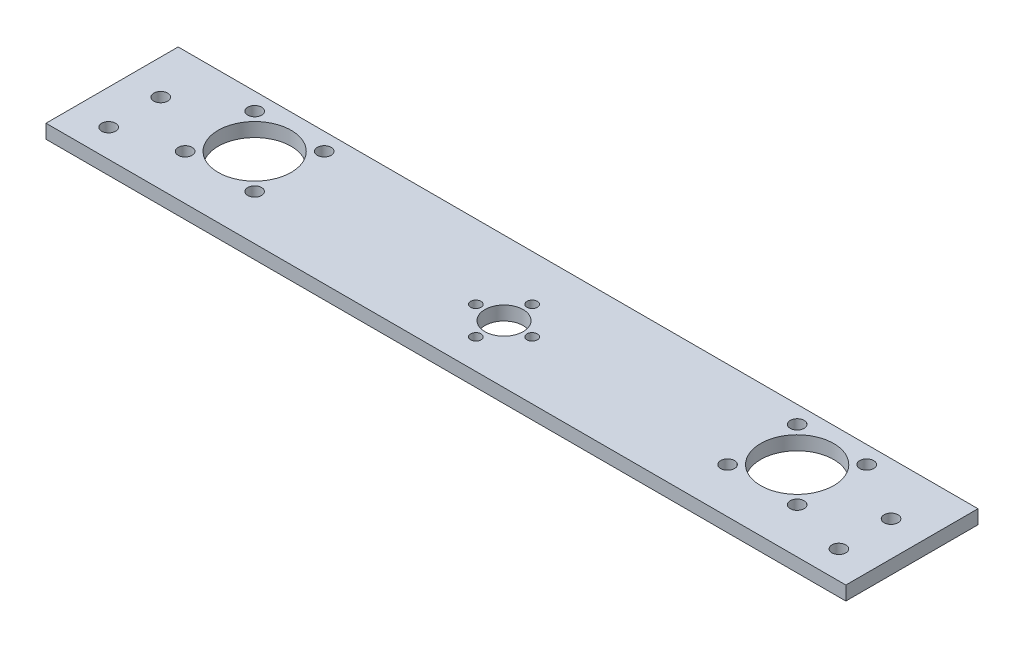
ISO-10303-21;
HEADER;
FILE_DESCRIPTION(('STEP AP214'),'2;1');
FILE_NAME('part.step','',(''),(''),'','','');
FILE_SCHEMA(('AUTOMOTIVE_DESIGN { 1 0 10303 214 1 1 1 1 }'));
ENDSEC;
DATA;
#1=APPLICATION_CONTEXT('core data for automotive mechanical design processes');
#2=APPLICATION_PROTOCOL_DEFINITION('international standard','automotive_design',2000,#1);
#3=PRODUCT_CONTEXT('',#1,'mechanical');
#4=PRODUCT('Part','Part','',(#3));
#5=PRODUCT_RELATED_PRODUCT_CATEGORY('part','',(#4));
#6=PRODUCT_DEFINITION_FORMATION('','',#4);
#7=PRODUCT_DEFINITION_CONTEXT('part definition',#1,'design');
#8=PRODUCT_DEFINITION('design','',#6,#7);
#9=PRODUCT_DEFINITION_SHAPE('','',#8);
#10=(LENGTH_UNIT() NAMED_UNIT(*) SI_UNIT(.MILLI.,.METRE.));
#11=(NAMED_UNIT(*) PLANE_ANGLE_UNIT() SI_UNIT($,.RADIAN.));
#12=(NAMED_UNIT(*) SI_UNIT($,.STERADIAN.) SOLID_ANGLE_UNIT());
#13=UNCERTAINTY_MEASURE_WITH_UNIT(LENGTH_MEASURE(1.E-05),#10,'distance_accuracy_value','');
#14=(GEOMETRIC_REPRESENTATION_CONTEXT(3) GLOBAL_UNCERTAINTY_ASSIGNED_CONTEXT((#13)) GLOBAL_UNIT_ASSIGNED_CONTEXT((#10,
#11,#12)) REPRESENTATION_CONTEXT('',''));
#15=CARTESIAN_POINT('',(0.,0.,0.));
#16=DIRECTION('',(0.,0.,1.));
#17=DIRECTION('',(1.,0.,0.));
#18=AXIS2_PLACEMENT_3D('',#15,#16,#17);
#19=CARTESIAN_POINT('',(-112.5,4.,8.));
#20=DIRECTION('',(0.,0.,-1.));
#21=DIRECTION('',(-1.,0.,0.));
#22=AXIS2_PLACEMENT_3D('',#19,#20,#21);
#23=PLANE('',#22);
#24=DIRECTION('',(1.,0.,0.));
#25=VECTOR('',#24,1.);
#26=CARTESIAN_POINT('',(-112.5,0.,8.));
#27=LINE('',#26,#25);
#28=CARTESIAN_POINT('',(-117.5,0.,8.));
#29=VERTEX_POINT('',#28);
#30=CARTESIAN_POINT('',(112.5,0.,8.));
#31=VERTEX_POINT('',#30);
#32=EDGE_CURVE('E62',#29,#31,#27,.T.);
#33=ORIENTED_EDGE('',*,*,#32,.T.);
#34=DIRECTION('',(0.,-1.,0.));
#35=VECTOR('',#34,1.);
#36=CARTESIAN_POINT('',(112.5,4.,8.));
#37=LINE('',#36,#35);
#38=CARTESIAN_POINT('',(112.5,4.,8.));
#39=VERTEX_POINT('',#38);
#40=EDGE_CURVE('E11',#39,#31,#37,.T.);
#41=ORIENTED_EDGE('',*,*,#40,.F.);
#42=DIRECTION('',(1.,0.,0.));
#43=VECTOR('',#42,1.);
#44=CARTESIAN_POINT('',(-112.5,4.,8.));
#45=LINE('',#44,#43);
#46=CARTESIAN_POINT('',(-117.5,4.,8.));
#47=VERTEX_POINT('',#46);
#48=EDGE_CURVE('E75',#47,#39,#45,.T.);
#49=ORIENTED_EDGE('',*,*,#48,.F.);
#50=DIRECTION('',(0.,1.,0.));
#51=VECTOR('',#50,1.);
#52=CARTESIAN_POINT('',(-117.5,0.,8.));
#53=LINE('',#52,#51);
#54=EDGE_CURVE('E77',#29,#47,#53,.T.);
#55=ORIENTED_EDGE('',*,*,#54,.F.);
#56=EDGE_LOOP('',(#33,#41,#49,#55));
#57=FACE_BOUND('',#56,.T.);
#58=ADVANCED_FACE('F33',(#57),#23,.F.);
#59=CARTESIAN_POINT('',(112.5,4.,-30.));
#60=DIRECTION('',(-1.,0.,0.));
#61=DIRECTION('',(0.,0.,1.));
#62=AXIS2_PLACEMENT_3D('',#59,#60,#61);
#63=PLANE('',#62);
#64=DIRECTION('',(0.,0.,-1.));
#65=VECTOR('',#64,1.);
#66=CARTESIAN_POINT('',(112.5,0.,-30.));
#67=LINE('',#66,#65);
#68=CARTESIAN_POINT('',(112.5,0.,-30.));
#69=VERTEX_POINT('',#68);
#70=EDGE_CURVE('E125',#31,#69,#67,.T.);
#71=ORIENTED_EDGE('',*,*,#70,.T.);
#72=DIRECTION('',(0.,-1.,0.));
#73=VECTOR('',#72,1.);
#74=CARTESIAN_POINT('',(112.5,4.,-30.));
#75=LINE('',#74,#73);
#76=CARTESIAN_POINT('',(112.5,4.,-30.));
#77=VERTEX_POINT('',#76);
#78=EDGE_CURVE('E42',#77,#69,#75,.T.);
#79=ORIENTED_EDGE('',*,*,#78,.F.);
#80=DIRECTION('',(0.,0.,-1.));
#81=VECTOR('',#80,1.);
#82=CARTESIAN_POINT('',(112.5,4.,-30.));
#83=LINE('',#82,#81);
#84=EDGE_CURVE('E51',#39,#77,#83,.T.);
#85=ORIENTED_EDGE('',*,*,#84,.F.);
#86=ORIENTED_EDGE('',*,*,#40,.T.);
#87=EDGE_LOOP('',(#71,#79,#85,#86));
#88=FACE_BOUND('',#87,.T.);
#89=ADVANCED_FACE('F234',(#88),#63,.F.);
#90=CARTESIAN_POINT('',(-112.5,4.,-30.));
#91=DIRECTION('',(0.,0.,1.));
#92=DIRECTION('',(1.,0.,0.));
#93=AXIS2_PLACEMENT_3D('',#90,#91,#92);
#94=PLANE('',#93);
#95=DIRECTION('',(0.,1.,0.));
#96=VECTOR('',#95,1.);
#97=CARTESIAN_POINT('',(-117.5,0.,-30.));
#98=LINE('',#97,#96);
#99=CARTESIAN_POINT('',(-117.5,0.,-30.));
#100=VERTEX_POINT('',#99);
#101=CARTESIAN_POINT('',(-117.5,4.,-30.));
#102=VERTEX_POINT('',#101);
#103=EDGE_CURVE('E89',#100,#102,#98,.T.);
#104=ORIENTED_EDGE('',*,*,#103,.T.);
#105=DIRECTION('',(-1.,0.,0.));
#106=VECTOR('',#105,1.);
#107=CARTESIAN_POINT('',(-112.5,4.,-30.));
#108=LINE('',#107,#106);
#109=EDGE_CURVE('E94',#77,#102,#108,.T.);
#110=ORIENTED_EDGE('',*,*,#109,.F.);
#111=ORIENTED_EDGE('',*,*,#78,.T.);
#112=DIRECTION('',(-1.,0.,0.));
#113=VECTOR('',#112,1.);
#114=CARTESIAN_POINT('',(-112.5,0.,-30.));
#115=LINE('',#114,#113);
#116=EDGE_CURVE('E80',#69,#100,#115,.T.);
#117=ORIENTED_EDGE('',*,*,#116,.T.);
#118=EDGE_LOOP('',(#104,#110,#111,#117));
#119=FACE_BOUND('',#118,.T.);
#120=ADVANCED_FACE('F225',(#119),#94,.F.);
#121=CARTESIAN_POINT('',(0.,4.,0.));
#122=DIRECTION('',(0.,1.,0.));
#123=DIRECTION('',(0.,0.,1.));
#124=AXIS2_PLACEMENT_3D('',#121,#122,#123);
#125=PLANE('',#124);
#126=CARTESIAN_POINT('',(-10.5999999999201,4.,-8.70000000007985));
#127=DIRECTION('',(0.,1.,0.));
#128=DIRECTION('',(1.,0.,0.));
#129=AXIS2_PLACEMENT_3D('',#126,#127,#128);
#130=CIRCLE('',#129,1.5);
#131=CARTESIAN_POINT('',(-9.09999999992013,4.,-8.70000000007985));
#132=VERTEX_POINT('',#131);
#133=EDGE_CURVE('E173',#132,#132,#130,.T.);
#134=ORIENTED_EDGE('',*,*,#133,.F.);
#135=EDGE_LOOP('',(#134));
#136=FACE_BOUND('',#135,.T.);
#137=CARTESIAN_POINT('',(-2.50000000000002,4.,-0.600000000159754));
#138=DIRECTION('',(0.,1.,0.));
#139=DIRECTION('',(0.,0.,-1.));
#140=AXIS2_PLACEMENT_3D('',#137,#138,#139);
#141=CIRCLE('',#140,1.5);
#142=CARTESIAN_POINT('',(-2.50000000000002,4.,-2.10000000015976));
#143=VERTEX_POINT('',#142);
#144=EDGE_CURVE('E493',#143,#143,#141,.T.);
#145=ORIENTED_EDGE('',*,*,#144,.F.);
#146=EDGE_LOOP('',(#145));
#147=FACE_BOUND('',#146,.T.);
#148=CARTESIAN_POINT('',(5.5999999999201,4.,-8.70000000007996));
#149=DIRECTION('',(0.,1.,0.));
#150=DIRECTION('',(-1.,0.,0.));
#151=AXIS2_PLACEMENT_3D('',#148,#149,#150);
#152=CIRCLE('',#151,1.5);
#153=CARTESIAN_POINT('',(4.0999999999201,4.,-8.70000000007995));
#154=VERTEX_POINT('',#153);
#155=EDGE_CURVE('E186',#154,#154,#152,.T.);
#156=ORIENTED_EDGE('',*,*,#155,.F.);
#157=EDGE_LOOP('',(#156));
#158=FACE_BOUND('',#157,.T.);
#159=CARTESIAN_POINT('',(-2.50000000000002,4.,-16.8));
#160=DIRECTION('',(0.,1.,0.));
#161=DIRECTION('',(0.,0.,1.));
#162=AXIS2_PLACEMENT_3D('',#159,#160,#161);
#163=CIRCLE('',#162,1.5);
#164=CARTESIAN_POINT('',(-2.50000000000002,4.,-15.3));
#165=VERTEX_POINT('',#164);
#166=EDGE_CURVE('E169',#165,#165,#163,.T.);
#167=ORIENTED_EDGE('',*,*,#166,.F.);
#168=EDGE_LOOP('',(#167));
#169=FACE_BOUND('',#168,.T.);
#170=CARTESIAN_POINT('',(85.5,4.,-5.00000000000008));
#171=DIRECTION('',(0.,1.,0.));
#172=DIRECTION('',(0.,0.,1.));
#173=AXIS2_PLACEMENT_3D('',#170,#171,#172);
#174=CIRCLE('',#173,2.);
#175=CARTESIAN_POINT('',(85.5,4.,-3.00000000000009));
#176=VERTEX_POINT('',#175);
#177=EDGE_CURVE('E197',#176,#176,#174,.T.);
#178=ORIENTED_EDGE('',*,*,#177,.F.);
#179=EDGE_LOOP('',(#178));
#180=FACE_BOUND('',#179,.T.);
#181=CARTESIAN_POINT('',(85.5,4.,-25.0000000000001));
#182=DIRECTION('',(0.,1.,0.));
#183=DIRECTION('',(0.,0.,1.));
#184=AXIS2_PLACEMENT_3D('',#181,#182,#183);
#185=CIRCLE('',#184,2.);
#186=CARTESIAN_POINT('',(85.5,4.,-23.0000000000001));
#187=VERTEX_POINT('',#186);
#188=EDGE_CURVE('E200',#187,#187,#185,.T.);
#189=ORIENTED_EDGE('',*,*,#188,.F.);
#190=EDGE_LOOP('',(#189));
#191=FACE_BOUND('',#190,.T.);
#192=CARTESIAN_POINT('',(65.5,4.,-25.0000000000001));
#193=DIRECTION('',(0.,1.,0.));
#194=DIRECTION('',(0.,0.,1.));
#195=AXIS2_PLACEMENT_3D('',#192,#193,#194);
#196=CIRCLE('',#195,2.);
#197=CARTESIAN_POINT('',(65.5,4.,-23.0000000000001));
#198=VERTEX_POINT('',#197);
#199=EDGE_CURVE('E203',#198,#198,#196,.T.);
#200=ORIENTED_EDGE('',*,*,#199,.F.);
#201=EDGE_LOOP('',(#200));
#202=FACE_BOUND('',#201,.T.);
#203=CARTESIAN_POINT('',(-70.5,4.,-25.0000000000001));
#204=DIRECTION('',(0.,1.,0.));
#205=DIRECTION('',(0.,0.,-1.));
#206=AXIS2_PLACEMENT_3D('',#203,#204,#205);
#207=CIRCLE('',#206,2.);
#208=CARTESIAN_POINT('',(-70.5,4.,-27.0000000000001));
#209=VERTEX_POINT('',#208);
#210=EDGE_CURVE('E191',#209,#209,#207,.T.);
#211=ORIENTED_EDGE('',*,*,#210,.F.);
#212=EDGE_LOOP('',(#211));
#213=FACE_BOUND('',#212,.T.);
#214=CARTESIAN_POINT('',(-90.5,4.,-25.0000000000001));
#215=DIRECTION('',(0.,1.,0.));
#216=DIRECTION('',(0.,0.,-1.));
#217=AXIS2_PLACEMENT_3D('',#214,#215,#216);
#218=CIRCLE('',#217,2.);
#219=CARTESIAN_POINT('',(-90.5,4.,-27.0000000000001));
#220=VERTEX_POINT('',#219);
#221=EDGE_CURVE('E188',#220,#220,#218,.T.);
#222=ORIENTED_EDGE('',*,*,#221,.F.);
#223=EDGE_LOOP('',(#222));
#224=FACE_BOUND('',#223,.T.);
#225=CARTESIAN_POINT('',(-90.5,4.,-5.00000000000008));
#226=DIRECTION('',(0.,1.,0.));
#227=DIRECTION('',(0.,0.,-1.));
#228=AXIS2_PLACEMENT_3D('',#225,#226,#227);
#229=CIRCLE('',#228,2.);
#230=CARTESIAN_POINT('',(-90.5,4.,-7.00000000000008));
#231=VERTEX_POINT('',#230);
#232=EDGE_CURVE('E192',#231,#231,#229,.T.);
#233=ORIENTED_EDGE('',*,*,#232,.F.);
#234=EDGE_LOOP('',(#233));
#235=FACE_BOUND('',#234,.T.);
#236=CARTESIAN_POINT('',(-70.5,4.,-5.0000000000001));
#237=DIRECTION('',(0.,1.,0.));
#238=DIRECTION('',(0.,0.,-1.));
#239=AXIS2_PLACEMENT_3D('',#236,#237,#238);
#240=CIRCLE('',#239,2.);
#241=CARTESIAN_POINT('',(-70.5,4.,-7.0000000000001));
#242=VERTEX_POINT('',#241);
#243=EDGE_CURVE('E168',#242,#242,#240,.T.);
#244=ORIENTED_EDGE('',*,*,#243,.F.);
#245=EDGE_LOOP('',(#244));
#246=FACE_BOUND('',#245,.T.);
#247=CARTESIAN_POINT('',(65.5,4.,-5.0000000000001));
#248=DIRECTION('',(0.,1.,0.));
#249=DIRECTION('',(0.,0.,1.));
#250=AXIS2_PLACEMENT_3D('',#247,#248,#249);
#251=CIRCLE('',#250,2.);
#252=CARTESIAN_POINT('',(65.5,4.,-3.00000000000011));
#253=VERTEX_POINT('',#252);
#254=EDGE_CURVE('E143',#253,#253,#251,.T.);
#255=ORIENTED_EDGE('',*,*,#254,.F.);
#256=EDGE_LOOP('',(#255));
#257=FACE_BOUND('',#256,.T.);
#258=CARTESIAN_POINT('',(-107.5,4.,0.));
#259=DIRECTION('',(0.,1.,0.));
#260=DIRECTION('',(0.,0.,-1.));
#261=AXIS2_PLACEMENT_3D('',#258,#259,#260);
#262=CIRCLE('',#261,2.);
#263=CARTESIAN_POINT('',(-107.5,4.,-2.00000000000002));
#264=VERTEX_POINT('',#263);
#265=EDGE_CURVE('E164',#264,#264,#262,.T.);
#266=ORIENTED_EDGE('',*,*,#265,.F.);
#267=EDGE_LOOP('',(#266));
#268=FACE_BOUND('',#267,.T.);
#269=CARTESIAN_POINT('',(-107.5,4.,-15.));
#270=DIRECTION('',(0.,1.,0.));
#271=DIRECTION('',(0.,0.,-1.));
#272=AXIS2_PLACEMENT_3D('',#269,#270,#271);
#273=CIRCLE('',#272,2.);
#274=CARTESIAN_POINT('',(-107.5,4.,-17.));
#275=VERTEX_POINT('',#274);
#276=EDGE_CURVE('E213',#275,#275,#273,.T.);
#277=ORIENTED_EDGE('',*,*,#276,.F.);
#278=EDGE_LOOP('',(#277));
#279=FACE_BOUND('',#278,.T.);
#280=CARTESIAN_POINT('',(102.5,4.,-15.));
#281=DIRECTION('',(0.,1.,0.));
#282=DIRECTION('',(0.,0.,1.));
#283=AXIS2_PLACEMENT_3D('',#280,#281,#282);
#284=CIRCLE('',#283,2.);
#285=CARTESIAN_POINT('',(102.5,4.,-13.));
#286=VERTEX_POINT('',#285);
#287=EDGE_CURVE('E210',#286,#286,#284,.T.);
#288=ORIENTED_EDGE('',*,*,#287,.F.);
#289=EDGE_LOOP('',(#288));
#290=FACE_BOUND('',#289,.T.);
#291=CARTESIAN_POINT('',(102.5,4.,0.));
#292=DIRECTION('',(0.,1.,0.));
#293=DIRECTION('',(0.,0.,1.));
#294=AXIS2_PLACEMENT_3D('',#291,#292,#293);
#295=CIRCLE('',#294,2.);
#296=CARTESIAN_POINT('',(102.5,4.,1.99999999999997));
#297=VERTEX_POINT('',#296);
#298=EDGE_CURVE('E134',#297,#297,#295,.T.);
#299=ORIENTED_EDGE('',*,*,#298,.F.);
#300=EDGE_LOOP('',(#299));
#301=FACE_BOUND('',#300,.T.);
#302=ORIENTED_EDGE('',*,*,#48,.T.);
#303=ORIENTED_EDGE('',*,*,#84,.T.);
#304=ORIENTED_EDGE('',*,*,#109,.T.);
#305=DIRECTION('',(0.,0.,1.));
#306=VECTOR('',#305,1.);
#307=CARTESIAN_POINT('',(-117.5,4.,-30.));
#308=LINE('',#307,#306);
#309=EDGE_CURVE('E86',#102,#47,#308,.T.);
#310=ORIENTED_EDGE('',*,*,#309,.T.);
#311=EDGE_LOOP('',(#302,#303,#304,#310));
#312=FACE_BOUND('',#311,.T.);
#313=CARTESIAN_POINT('',(75.5,4.,-15.));
#314=DIRECTION('',(0.,1.,0.));
#315=DIRECTION('',(0.,0.,1.));
#316=AXIS2_PLACEMENT_3D('',#313,#314,#315);
#317=CIRCLE('',#316,10.5);
#318=CARTESIAN_POINT('',(75.5,4.,-4.50000000000004));
#319=VERTEX_POINT('',#318);
#320=EDGE_CURVE('E105',#319,#319,#317,.T.);
#321=ORIENTED_EDGE('',*,*,#320,.F.);
#322=EDGE_LOOP('',(#321));
#323=FACE_BOUND('',#322,.T.);
#324=CARTESIAN_POINT('',(-80.5,4.,-15.));
#325=DIRECTION('',(0.,1.,0.));
#326=DIRECTION('',(0.,0.,1.));
#327=AXIS2_PLACEMENT_3D('',#324,#325,#326);
#328=CIRCLE('',#327,10.5);
#329=CARTESIAN_POINT('',(-80.5,4.,-4.50000000000004));
#330=VERTEX_POINT('',#329);
#331=EDGE_CURVE('E112',#330,#330,#328,.T.);
#332=ORIENTED_EDGE('',*,*,#331,.F.);
#333=EDGE_LOOP('',(#332));
#334=FACE_BOUND('',#333,.T.);
#335=CARTESIAN_POINT('',(-2.50000000000002,4.,-8.70000000007988));
#336=DIRECTION('',(0.,1.,0.));
#337=DIRECTION('',(0.,0.,1.));
#338=AXIS2_PLACEMENT_3D('',#335,#336,#337);
#339=CIRCLE('',#338,5.5);
#340=CARTESIAN_POINT('',(-2.50000000000002,4.,-3.20000000007988));
#341=VERTEX_POINT('',#340);
#342=EDGE_CURVE('E88',#341,#341,#339,.T.);
#343=ORIENTED_EDGE('',*,*,#342,.F.);
#344=EDGE_LOOP('',(#343));
#345=FACE_BOUND('',#344,.T.);
#346=ADVANCED_FACE('F91',(#136,#147,#158,#169,#180,#191,#202,#213,#224,#235,#246,#257,#268,#279,
#290,#301,#312,#323,#334,#345),#125,.T.);
#347=CARTESIAN_POINT('',(0.,0.,0.));
#348=DIRECTION('',(0.,1.,0.));
#349=DIRECTION('',(0.,0.,1.));
#350=AXIS2_PLACEMENT_3D('',#347,#348,#349);
#351=PLANE('',#350);
#352=CARTESIAN_POINT('',(-10.5999999999201,0.,-8.70000000007985));
#353=DIRECTION('',(0.,1.,0.));
#354=DIRECTION('',(0.,0.,1.));
#355=AXIS2_PLACEMENT_3D('',#352,#353,#354);
#356=CIRCLE('',#355,1.5);
#357=CARTESIAN_POINT('',(-10.5999999999201,0.,-7.20000000007985));
#358=VERTEX_POINT('',#357);
#359=EDGE_CURVE('E36',#358,#358,#356,.T.);
#360=ORIENTED_EDGE('',*,*,#359,.T.);
#361=EDGE_LOOP('',(#360));
#362=FACE_BOUND('',#361,.T.);
#363=CARTESIAN_POINT('',(-2.50000000000002,0.,-0.600000000159754));
#364=DIRECTION('',(0.,1.,0.));
#365=DIRECTION('',(0.,0.,1.));
#366=AXIS2_PLACEMENT_3D('',#363,#364,#365);
#367=CIRCLE('',#366,1.5);
#368=CARTESIAN_POINT('',(-2.50000000000002,0.,0.899999999840248));
#369=VERTEX_POINT('',#368);
#370=EDGE_CURVE('E172',#369,#369,#367,.T.);
#371=ORIENTED_EDGE('',*,*,#370,.T.);
#372=EDGE_LOOP('',(#371));
#373=FACE_BOUND('',#372,.T.);
#374=CARTESIAN_POINT('',(5.5999999999201,0.,-8.70000000007996));
#375=DIRECTION('',(0.,1.,0.));
#376=DIRECTION('',(0.,0.,1.));
#377=AXIS2_PLACEMENT_3D('',#374,#375,#376);
#378=CIRCLE('',#377,1.5);
#379=CARTESIAN_POINT('',(5.5999999999201,0.,-7.20000000007996));
#380=VERTEX_POINT('',#379);
#381=EDGE_CURVE('E170',#380,#380,#378,.T.);
#382=ORIENTED_EDGE('',*,*,#381,.T.);
#383=EDGE_LOOP('',(#382));
#384=FACE_BOUND('',#383,.T.);
#385=CARTESIAN_POINT('',(-2.50000000000002,0.,-16.8));
#386=DIRECTION('',(0.,1.,0.));
#387=DIRECTION('',(0.,0.,1.));
#388=AXIS2_PLACEMENT_3D('',#385,#386,#387);
#389=CIRCLE('',#388,1.5);
#390=CARTESIAN_POINT('',(-2.50000000000002,0.,-15.3));
#391=VERTEX_POINT('',#390);
#392=EDGE_CURVE('E165',#391,#391,#389,.T.);
#393=ORIENTED_EDGE('',*,*,#392,.T.);
#394=EDGE_LOOP('',(#393));
#395=FACE_BOUND('',#394,.T.);
#396=CARTESIAN_POINT('',(85.5,0.,-5.00000000000008));
#397=DIRECTION('',(0.,1.,0.));
#398=DIRECTION('',(0.,0.,1.));
#399=AXIS2_PLACEMENT_3D('',#396,#397,#398);
#400=CIRCLE('',#399,2.);
#401=CARTESIAN_POINT('',(85.5,0.,-3.00000000000009));
#402=VERTEX_POINT('',#401);
#403=EDGE_CURVE('E161',#402,#402,#400,.T.);
#404=ORIENTED_EDGE('',*,*,#403,.T.);
#405=EDGE_LOOP('',(#404));
#406=FACE_BOUND('',#405,.T.);
#407=CARTESIAN_POINT('',(85.5,0.,-25.0000000000001));
#408=DIRECTION('',(0.,1.,0.));
#409=DIRECTION('',(0.,0.,1.));
#410=AXIS2_PLACEMENT_3D('',#407,#408,#409);
#411=CIRCLE('',#410,2.);
#412=CARTESIAN_POINT('',(85.5,0.,-23.0000000000001));
#413=VERTEX_POINT('',#412);
#414=EDGE_CURVE('E158',#413,#413,#411,.T.);
#415=ORIENTED_EDGE('',*,*,#414,.T.);
#416=EDGE_LOOP('',(#415));
#417=FACE_BOUND('',#416,.T.);
#418=CARTESIAN_POINT('',(65.5,0.,-25.0000000000001));
#419=DIRECTION('',(0.,1.,0.));
#420=DIRECTION('',(0.,0.,1.));
#421=AXIS2_PLACEMENT_3D('',#418,#419,#420);
#422=CIRCLE('',#421,2.);
#423=CARTESIAN_POINT('',(65.5,0.,-23.0000000000001));
#424=VERTEX_POINT('',#423);
#425=EDGE_CURVE('E155',#424,#424,#422,.T.);
#426=ORIENTED_EDGE('',*,*,#425,.T.);
#427=EDGE_LOOP('',(#426));
#428=FACE_BOUND('',#427,.T.);
#429=CARTESIAN_POINT('',(-70.5,0.,-25.0000000000001));
#430=DIRECTION('',(0.,1.,0.));
#431=DIRECTION('',(0.,0.,1.));
#432=AXIS2_PLACEMENT_3D('',#429,#430,#431);
#433=CIRCLE('',#432,2.);
#434=CARTESIAN_POINT('',(-70.5,0.,-23.0000000000001));
#435=VERTEX_POINT('',#434);
#436=EDGE_CURVE('E152',#435,#435,#433,.T.);
#437=ORIENTED_EDGE('',*,*,#436,.T.);
#438=EDGE_LOOP('',(#437));
#439=FACE_BOUND('',#438,.T.);
#440=CARTESIAN_POINT('',(-90.5,0.,-25.0000000000001));
#441=DIRECTION('',(0.,1.,0.));
#442=DIRECTION('',(0.,0.,1.));
#443=AXIS2_PLACEMENT_3D('',#440,#441,#442);
#444=CIRCLE('',#443,2.);
#445=CARTESIAN_POINT('',(-90.5,0.,-23.0000000000001));
#446=VERTEX_POINT('',#445);
#447=EDGE_CURVE('E149',#446,#446,#444,.T.);
#448=ORIENTED_EDGE('',*,*,#447,.T.);
#449=EDGE_LOOP('',(#448));
#450=FACE_BOUND('',#449,.T.);
#451=CARTESIAN_POINT('',(-90.5,0.,-5.00000000000008));
#452=DIRECTION('',(0.,1.,0.));
#453=DIRECTION('',(0.,0.,1.));
#454=AXIS2_PLACEMENT_3D('',#451,#452,#453);
#455=CIRCLE('',#454,2.);
#456=CARTESIAN_POINT('',(-90.5,0.,-3.00000000000009));
#457=VERTEX_POINT('',#456);
#458=EDGE_CURVE('E146',#457,#457,#455,.T.);
#459=ORIENTED_EDGE('',*,*,#458,.T.);
#460=EDGE_LOOP('',(#459));
#461=FACE_BOUND('',#460,.T.);
#462=CARTESIAN_POINT('',(-70.5,0.,-5.0000000000001));
#463=DIRECTION('',(0.,1.,0.));
#464=DIRECTION('',(0.,0.,1.));
#465=AXIS2_PLACEMENT_3D('',#462,#463,#464);
#466=CIRCLE('',#465,2.);
#467=CARTESIAN_POINT('',(-70.5,0.,-3.00000000000011));
#468=VERTEX_POINT('',#467);
#469=EDGE_CURVE('E142',#468,#468,#466,.T.);
#470=ORIENTED_EDGE('',*,*,#469,.T.);
#471=EDGE_LOOP('',(#470));
#472=FACE_BOUND('',#471,.T.);
#473=CARTESIAN_POINT('',(65.5,0.,-5.0000000000001));
#474=DIRECTION('',(0.,1.,0.));
#475=DIRECTION('',(0.,0.,1.));
#476=AXIS2_PLACEMENT_3D('',#473,#474,#475);
#477=CIRCLE('',#476,2.);
#478=CARTESIAN_POINT('',(65.5,0.,-3.00000000000011));
#479=VERTEX_POINT('',#478);
#480=EDGE_CURVE('E139',#479,#479,#477,.T.);
#481=ORIENTED_EDGE('',*,*,#480,.T.);
#482=EDGE_LOOP('',(#481));
#483=FACE_BOUND('',#482,.T.);
#484=CARTESIAN_POINT('',(-107.5,0.,0.));
#485=DIRECTION('',(0.,1.,0.));
#486=DIRECTION('',(0.,0.,1.));
#487=AXIS2_PLACEMENT_3D('',#484,#485,#486);
#488=CIRCLE('',#487,2.);
#489=CARTESIAN_POINT('',(-107.5,0.,1.99999999999997));
#490=VERTEX_POINT('',#489);
#491=EDGE_CURVE('E96',#490,#490,#488,.T.);
#492=ORIENTED_EDGE('',*,*,#491,.T.);
#493=EDGE_LOOP('',(#492));
#494=FACE_BOUND('',#493,.T.);
#495=CARTESIAN_POINT('',(-107.5,0.,-15.));
#496=DIRECTION('',(0.,1.,0.));
#497=DIRECTION('',(0.,0.,1.));
#498=AXIS2_PLACEMENT_3D('',#495,#496,#497);
#499=CIRCLE('',#498,2.);
#500=CARTESIAN_POINT('',(-107.5,0.,-13.));
#501=VERTEX_POINT('',#500);
#502=EDGE_CURVE('E100',#501,#501,#499,.T.);
#503=ORIENTED_EDGE('',*,*,#502,.T.);
#504=EDGE_LOOP('',(#503));
#505=FACE_BOUND('',#504,.T.);
#506=CARTESIAN_POINT('',(102.5,0.,-15.));
#507=DIRECTION('',(0.,1.,0.));
#508=DIRECTION('',(0.,0.,1.));
#509=AXIS2_PLACEMENT_3D('',#506,#507,#508);
#510=CIRCLE('',#509,2.);
#511=CARTESIAN_POINT('',(102.5,0.,-13.));
#512=VERTEX_POINT('',#511);
#513=EDGE_CURVE('E133',#512,#512,#510,.T.);
#514=ORIENTED_EDGE('',*,*,#513,.T.);
#515=EDGE_LOOP('',(#514));
#516=FACE_BOUND('',#515,.T.);
#517=CARTESIAN_POINT('',(102.5,0.,0.));
#518=DIRECTION('',(0.,1.,0.));
#519=DIRECTION('',(0.,0.,1.));
#520=AXIS2_PLACEMENT_3D('',#517,#518,#519);
#521=CIRCLE('',#520,2.);
#522=CARTESIAN_POINT('',(102.5,0.,1.99999999999997));
#523=VERTEX_POINT('',#522);
#524=EDGE_CURVE('E130',#523,#523,#521,.T.);
#525=ORIENTED_EDGE('',*,*,#524,.T.);
#526=EDGE_LOOP('',(#525));
#527=FACE_BOUND('',#526,.T.);
#528=CARTESIAN_POINT('',(75.5,0.,-15.));
#529=DIRECTION('',(0.,1.,0.));
#530=DIRECTION('',(0.,0.,1.));
#531=AXIS2_PLACEMENT_3D('',#528,#529,#530);
#532=CIRCLE('',#531,10.5);
#533=CARTESIAN_POINT('',(75.5,0.,-4.50000000000004));
#534=VERTEX_POINT('',#533);
#535=EDGE_CURVE('E108',#534,#534,#532,.F.);
#536=ORIENTED_EDGE('',*,*,#535,.F.);
#537=EDGE_LOOP('',(#536));
#538=FACE_BOUND('',#537,.T.);
#539=CARTESIAN_POINT('',(-80.5,0.,-15.));
#540=DIRECTION('',(0.,1.,0.));
#541=DIRECTION('',(0.,0.,1.));
#542=AXIS2_PLACEMENT_3D('',#539,#540,#541);
#543=CIRCLE('',#542,10.5);
#544=CARTESIAN_POINT('',(-80.5,0.,-4.50000000000004));
#545=VERTEX_POINT('',#544);
#546=EDGE_CURVE('E109',#545,#545,#543,.F.);
#547=ORIENTED_EDGE('',*,*,#546,.F.);
#548=EDGE_LOOP('',(#547));
#549=FACE_BOUND('',#548,.T.);
#550=CARTESIAN_POINT('',(-2.50000000000002,0.,-8.70000000007988));
#551=DIRECTION('',(0.,1.,0.));
#552=DIRECTION('',(0.,0.,1.));
#553=AXIS2_PLACEMENT_3D('',#550,#551,#552);
#554=CIRCLE('',#553,5.5);
#555=CARTESIAN_POINT('',(-2.50000000000002,0.,-3.20000000007988));
#556=VERTEX_POINT('',#555);
#557=EDGE_CURVE('E115',#556,#556,#554,.F.);
#558=ORIENTED_EDGE('',*,*,#557,.F.);
#559=EDGE_LOOP('',(#558));
#560=FACE_BOUND('',#559,.T.);
#561=DIRECTION('',(0.,0.,1.));
#562=VECTOR('',#561,1.);
#563=CARTESIAN_POINT('',(-117.5,0.,-30.));
#564=LINE('',#563,#562);
#565=EDGE_CURVE('E87',#100,#29,#564,.T.);
#566=ORIENTED_EDGE('',*,*,#565,.F.);
#567=ORIENTED_EDGE('',*,*,#116,.F.);
#568=ORIENTED_EDGE('',*,*,#70,.F.);
#569=ORIENTED_EDGE('',*,*,#32,.F.);
#570=EDGE_LOOP('',(#566,#567,#568,#569));
#571=FACE_BOUND('',#570,.T.);
#572=ADVANCED_FACE('F224',(#362,#373,#384,#395,#406,#417,#428,#439,#450,#461,#472,#483,#494,
#505,#516,#527,#538,#549,#560,#571),#351,.F.);
#573=CARTESIAN_POINT('',(-2.50000000000002,-0.00100000000000013,-8.70000000007988));
#574=DIRECTION('',(0.,1.,0.));
#575=DIRECTION('',(0.,0.,1.));
#576=AXIS2_PLACEMENT_3D('',#573,#574,#575);
#577=CYLINDRICAL_SURFACE('',#576,5.5);
#578=ORIENTED_EDGE('',*,*,#342,.T.);
#579=EDGE_LOOP('',(#578));
#580=FACE_BOUND('',#579,.T.);
#581=ORIENTED_EDGE('',*,*,#557,.T.);
#582=EDGE_LOOP('',(#581));
#583=FACE_BOUND('',#582,.T.);
#584=ADVANCED_FACE('F232',(#580,#583),#577,.F.);
#585=CARTESIAN_POINT('',(-80.5,-0.00100000000000013,-15.));
#586=DIRECTION('',(0.,1.,0.));
#587=DIRECTION('',(0.,0.,1.));
#588=AXIS2_PLACEMENT_3D('',#585,#586,#587);
#589=CYLINDRICAL_SURFACE('',#588,10.5);
#590=ORIENTED_EDGE('',*,*,#331,.T.);
#591=EDGE_LOOP('',(#590));
#592=FACE_BOUND('',#591,.T.);
#593=ORIENTED_EDGE('',*,*,#546,.T.);
#594=EDGE_LOOP('',(#593));
#595=FACE_BOUND('',#594,.T.);
#596=ADVANCED_FACE('F445',(#592,#595),#589,.F.);
#597=CARTESIAN_POINT('',(75.5,-0.00100000000000013,-15.));
#598=DIRECTION('',(0.,1.,0.));
#599=DIRECTION('',(0.,0.,1.));
#600=AXIS2_PLACEMENT_3D('',#597,#598,#599);
#601=CYLINDRICAL_SURFACE('',#600,10.5);
#602=ORIENTED_EDGE('',*,*,#320,.T.);
#603=EDGE_LOOP('',(#602));
#604=FACE_BOUND('',#603,.T.);
#605=ORIENTED_EDGE('',*,*,#535,.T.);
#606=EDGE_LOOP('',(#605));
#607=FACE_BOUND('',#606,.T.);
#608=ADVANCED_FACE('F267',(#604,#607),#601,.F.);
#609=CARTESIAN_POINT('',(-117.5,0.,-30.));
#610=DIRECTION('',(-1.,0.,0.));
#611=DIRECTION('',(0.,0.,1.));
#612=AXIS2_PLACEMENT_3D('',#609,#610,#611);
#613=PLANE('',#612);
#614=ORIENTED_EDGE('',*,*,#309,.F.);
#615=ORIENTED_EDGE('',*,*,#103,.F.);
#616=ORIENTED_EDGE('',*,*,#565,.T.);
#617=ORIENTED_EDGE('',*,*,#54,.T.);
#618=EDGE_LOOP('',(#614,#615,#616,#617));
#619=FACE_BOUND('',#618,.T.);
#620=ADVANCED_FACE('F84',(#619),#613,.T.);
#621=CARTESIAN_POINT('',(102.5,-23.,0.));
#622=DIRECTION('',(0.,1.,0.));
#623=DIRECTION('',(0.,0.,1.));
#624=AXIS2_PLACEMENT_3D('',#621,#622,#623);
#625=CYLINDRICAL_SURFACE('',#624,2.);
#626=ORIENTED_EDGE('',*,*,#298,.T.);
#627=EDGE_LOOP('',(#626));
#628=FACE_BOUND('',#627,.T.);
#629=ORIENTED_EDGE('',*,*,#524,.F.);
#630=EDGE_LOOP('',(#629));
#631=FACE_BOUND('',#630,.T.);
#632=ADVANCED_FACE('F220',(#628,#631),#625,.F.);
#633=CARTESIAN_POINT('',(102.5,-23.,-15.));
#634=DIRECTION('',(0.,1.,0.));
#635=DIRECTION('',(0.,0.,1.));
#636=AXIS2_PLACEMENT_3D('',#633,#634,#635);
#637=CYLINDRICAL_SURFACE('',#636,2.);
#638=ORIENTED_EDGE('',*,*,#287,.T.);
#639=EDGE_LOOP('',(#638));
#640=FACE_BOUND('',#639,.T.);
#641=ORIENTED_EDGE('',*,*,#513,.F.);
#642=EDGE_LOOP('',(#641));
#643=FACE_BOUND('',#642,.T.);
#644=ADVANCED_FACE('F278',(#640,#643),#637,.F.);
#645=CARTESIAN_POINT('',(-107.5,-23.,-15.));
#646=DIRECTION('',(0.,1.,0.));
#647=DIRECTION('',(0.,0.,1.));
#648=AXIS2_PLACEMENT_3D('',#645,#646,#647);
#649=CYLINDRICAL_SURFACE('',#648,2.);
#650=ORIENTED_EDGE('',*,*,#276,.T.);
#651=EDGE_LOOP('',(#650));
#652=FACE_BOUND('',#651,.T.);
#653=ORIENTED_EDGE('',*,*,#502,.F.);
#654=EDGE_LOOP('',(#653));
#655=FACE_BOUND('',#654,.T.);
#656=ADVANCED_FACE('F287',(#652,#655),#649,.F.);
#657=CARTESIAN_POINT('',(-107.5,-23.,0.));
#658=DIRECTION('',(0.,1.,0.));
#659=DIRECTION('',(0.,0.,1.));
#660=AXIS2_PLACEMENT_3D('',#657,#658,#659);
#661=CYLINDRICAL_SURFACE('',#660,2.);
#662=ORIENTED_EDGE('',*,*,#265,.T.);
#663=EDGE_LOOP('',(#662));
#664=FACE_BOUND('',#663,.T.);
#665=ORIENTED_EDGE('',*,*,#491,.F.);
#666=EDGE_LOOP('',(#665));
#667=FACE_BOUND('',#666,.T.);
#668=ADVANCED_FACE('F297',(#664,#667),#661,.F.);
#669=CARTESIAN_POINT('',(65.5,-23.,-5.0000000000001));
#670=DIRECTION('',(0.,1.,0.));
#671=DIRECTION('',(0.,0.,1.));
#672=AXIS2_PLACEMENT_3D('',#669,#670,#671);
#673=CYLINDRICAL_SURFACE('',#672,2.);
#674=ORIENTED_EDGE('',*,*,#254,.T.);
#675=EDGE_LOOP('',(#674));
#676=FACE_BOUND('',#675,.T.);
#677=ORIENTED_EDGE('',*,*,#480,.F.);
#678=EDGE_LOOP('',(#677));
#679=FACE_BOUND('',#678,.T.);
#680=ADVANCED_FACE('F307',(#676,#679),#673,.F.);
#681=CARTESIAN_POINT('',(-70.5,-23.,-5.0000000000001));
#682=DIRECTION('',(0.,1.,0.));
#683=DIRECTION('',(0.,0.,1.));
#684=AXIS2_PLACEMENT_3D('',#681,#682,#683);
#685=CYLINDRICAL_SURFACE('',#684,2.);
#686=ORIENTED_EDGE('',*,*,#243,.T.);
#687=EDGE_LOOP('',(#686));
#688=FACE_BOUND('',#687,.T.);
#689=ORIENTED_EDGE('',*,*,#469,.F.);
#690=EDGE_LOOP('',(#689));
#691=FACE_BOUND('',#690,.T.);
#692=ADVANCED_FACE('F317',(#688,#691),#685,.F.);
#693=CARTESIAN_POINT('',(-90.5,-23.,-5.00000000000008));
#694=DIRECTION('',(0.,1.,0.));
#695=DIRECTION('',(0.,0.,1.));
#696=AXIS2_PLACEMENT_3D('',#693,#694,#695);
#697=CYLINDRICAL_SURFACE('',#696,2.);
#698=ORIENTED_EDGE('',*,*,#232,.T.);
#699=EDGE_LOOP('',(#698));
#700=FACE_BOUND('',#699,.T.);
#701=ORIENTED_EDGE('',*,*,#458,.F.);
#702=EDGE_LOOP('',(#701));
#703=FACE_BOUND('',#702,.T.);
#704=ADVANCED_FACE('F327',(#700,#703),#697,.F.);
#705=CARTESIAN_POINT('',(-90.5,-23.,-25.0000000000001));
#706=DIRECTION('',(0.,1.,0.));
#707=DIRECTION('',(0.,0.,1.));
#708=AXIS2_PLACEMENT_3D('',#705,#706,#707);
#709=CYLINDRICAL_SURFACE('',#708,2.);
#710=ORIENTED_EDGE('',*,*,#221,.T.);
#711=EDGE_LOOP('',(#710));
#712=FACE_BOUND('',#711,.T.);
#713=ORIENTED_EDGE('',*,*,#447,.F.);
#714=EDGE_LOOP('',(#713));
#715=FACE_BOUND('',#714,.T.);
#716=ADVANCED_FACE('F337',(#712,#715),#709,.F.);
#717=CARTESIAN_POINT('',(-70.5,-23.,-25.0000000000001));
#718=DIRECTION('',(0.,1.,0.));
#719=DIRECTION('',(0.,0.,1.));
#720=AXIS2_PLACEMENT_3D('',#717,#718,#719);
#721=CYLINDRICAL_SURFACE('',#720,2.);
#722=ORIENTED_EDGE('',*,*,#210,.T.);
#723=EDGE_LOOP('',(#722));
#724=FACE_BOUND('',#723,.T.);
#725=ORIENTED_EDGE('',*,*,#436,.F.);
#726=EDGE_LOOP('',(#725));
#727=FACE_BOUND('',#726,.T.);
#728=ADVANCED_FACE('F347',(#724,#727),#721,.F.);
#729=CARTESIAN_POINT('',(65.5,-23.,-25.0000000000001));
#730=DIRECTION('',(0.,1.,0.));
#731=DIRECTION('',(0.,0.,1.));
#732=AXIS2_PLACEMENT_3D('',#729,#730,#731);
#733=CYLINDRICAL_SURFACE('',#732,2.);
#734=ORIENTED_EDGE('',*,*,#199,.T.);
#735=EDGE_LOOP('',(#734));
#736=FACE_BOUND('',#735,.T.);
#737=ORIENTED_EDGE('',*,*,#425,.F.);
#738=EDGE_LOOP('',(#737));
#739=FACE_BOUND('',#738,.T.);
#740=ADVANCED_FACE('F357',(#736,#739),#733,.F.);
#741=CARTESIAN_POINT('',(85.5,-23.,-25.0000000000001));
#742=DIRECTION('',(0.,1.,0.));
#743=DIRECTION('',(0.,0.,1.));
#744=AXIS2_PLACEMENT_3D('',#741,#742,#743);
#745=CYLINDRICAL_SURFACE('',#744,2.);
#746=ORIENTED_EDGE('',*,*,#188,.T.);
#747=EDGE_LOOP('',(#746));
#748=FACE_BOUND('',#747,.T.);
#749=ORIENTED_EDGE('',*,*,#414,.F.);
#750=EDGE_LOOP('',(#749));
#751=FACE_BOUND('',#750,.T.);
#752=ADVANCED_FACE('F367',(#748,#751),#745,.F.);
#753=CARTESIAN_POINT('',(85.5,-23.,-5.00000000000008));
#754=DIRECTION('',(0.,1.,0.));
#755=DIRECTION('',(0.,0.,1.));
#756=AXIS2_PLACEMENT_3D('',#753,#754,#755);
#757=CYLINDRICAL_SURFACE('',#756,2.);
#758=ORIENTED_EDGE('',*,*,#177,.T.);
#759=EDGE_LOOP('',(#758));
#760=FACE_BOUND('',#759,.T.);
#761=ORIENTED_EDGE('',*,*,#403,.F.);
#762=EDGE_LOOP('',(#761));
#763=FACE_BOUND('',#762,.T.);
#764=ADVANCED_FACE('F377',(#760,#763),#757,.F.);
#765=CARTESIAN_POINT('',(-2.50000000000002,-6.,-16.8));
#766=DIRECTION('',(0.,1.,0.));
#767=DIRECTION('',(0.,0.,1.));
#768=AXIS2_PLACEMENT_3D('',#765,#766,#767);
#769=CYLINDRICAL_SURFACE('',#768,1.5);
#770=ORIENTED_EDGE('',*,*,#166,.T.);
#771=EDGE_LOOP('',(#770));
#772=FACE_BOUND('',#771,.T.);
#773=ORIENTED_EDGE('',*,*,#392,.F.);
#774=EDGE_LOOP('',(#773));
#775=FACE_BOUND('',#774,.T.);
#776=ADVANCED_FACE('F387',(#772,#775),#769,.F.);
#777=CARTESIAN_POINT('',(5.5999999999201,-6.,-8.70000000007996));
#778=DIRECTION('',(0.,1.,0.));
#779=DIRECTION('',(0.,0.,1.));
#780=AXIS2_PLACEMENT_3D('',#777,#778,#779);
#781=CYLINDRICAL_SURFACE('',#780,1.5);
#782=ORIENTED_EDGE('',*,*,#155,.T.);
#783=EDGE_LOOP('',(#782));
#784=FACE_BOUND('',#783,.T.);
#785=ORIENTED_EDGE('',*,*,#381,.F.);
#786=EDGE_LOOP('',(#785));
#787=FACE_BOUND('',#786,.T.);
#788=ADVANCED_FACE('F396',(#784,#787),#781,.F.);
#789=CARTESIAN_POINT('',(-2.50000000000002,-6.,-0.600000000159754));
#790=DIRECTION('',(0.,1.,0.));
#791=DIRECTION('',(0.,0.,1.));
#792=AXIS2_PLACEMENT_3D('',#789,#790,#791);
#793=CYLINDRICAL_SURFACE('',#792,1.5);
#794=ORIENTED_EDGE('',*,*,#144,.T.);
#795=EDGE_LOOP('',(#794));
#796=FACE_BOUND('',#795,.T.);
#797=ORIENTED_EDGE('',*,*,#370,.F.);
#798=EDGE_LOOP('',(#797));
#799=FACE_BOUND('',#798,.T.);
#800=ADVANCED_FACE('F417',(#796,#799),#793,.F.);
#801=CARTESIAN_POINT('',(-10.5999999999201,-6.,-8.70000000007985));
#802=DIRECTION('',(0.,1.,0.));
#803=DIRECTION('',(0.,0.,1.));
#804=AXIS2_PLACEMENT_3D('',#801,#802,#803);
#805=CYLINDRICAL_SURFACE('',#804,1.5);
#806=ORIENTED_EDGE('',*,*,#133,.T.);
#807=EDGE_LOOP('',(#806));
#808=FACE_BOUND('',#807,.T.);
#809=ORIENTED_EDGE('',*,*,#359,.F.);
#810=EDGE_LOOP('',(#809));
#811=FACE_BOUND('',#810,.T.);
#812=ADVANCED_FACE('F427',(#808,#811),#805,.F.);
#813=CLOSED_SHELL('',(#58,#89,#120,#346,#572,#584,#596,#608,#620,#632,#644,#656,#668,#680,#692,
#704,#716,#728,#740,#752,#764,#776,#788,#800,#812));
#814=MANIFOLD_SOLID_BREP('B2',#813);
#815=ADVANCED_BREP_SHAPE_REPRESENTATION('',(#18,#814),#14);
#816=SHAPE_DEFINITION_REPRESENTATION(#9,#815);
ENDSEC;
END-ISO-10303-21;
